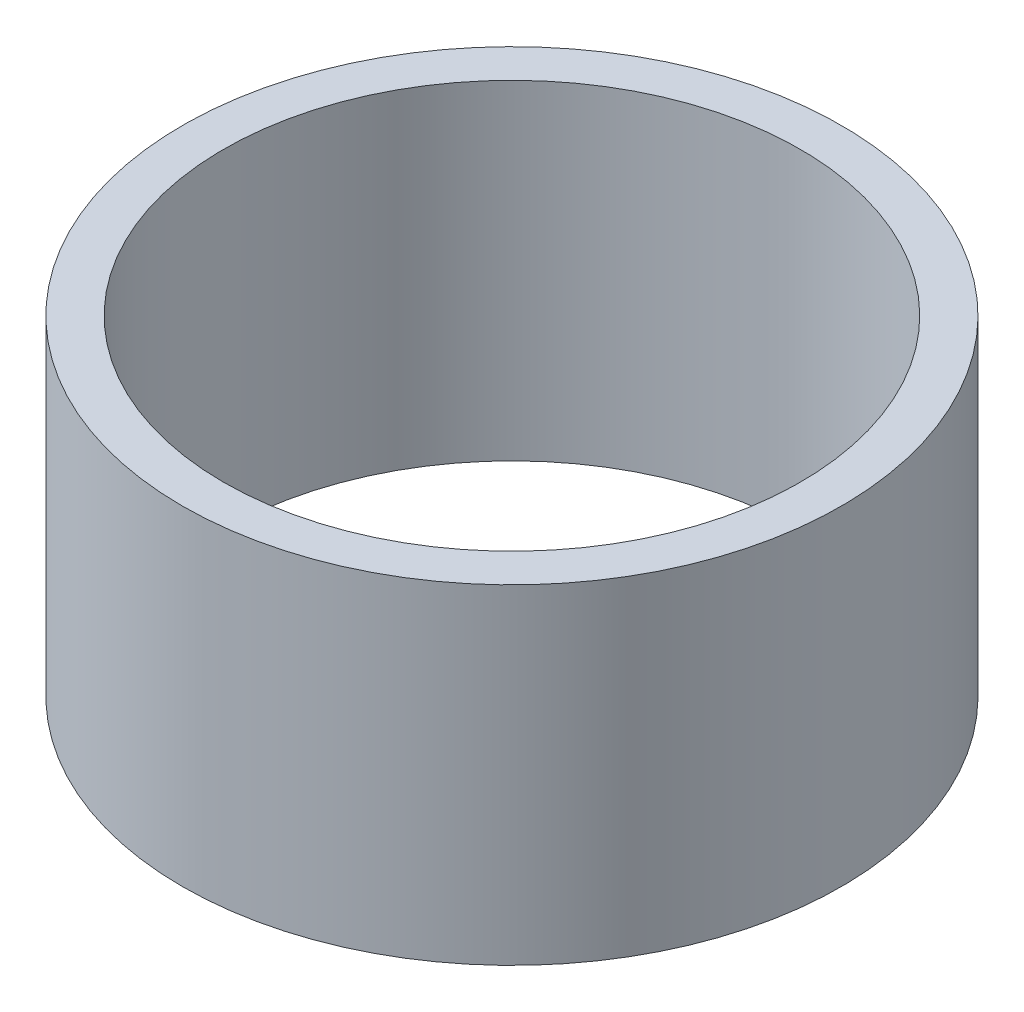
ISO-10303-21;
HEADER;
FILE_DESCRIPTION(('STEP AP214'),'2;1');
FILE_NAME('part.step','',(''),(''),'','','');
FILE_SCHEMA(('AUTOMOTIVE_DESIGN { 1 0 10303 214 1 1 1 1 }'));
ENDSEC;
DATA;
#1=APPLICATION_CONTEXT('core data for automotive mechanical design processes');
#2=APPLICATION_PROTOCOL_DEFINITION('international standard','automotive_design',2000,#1);
#3=PRODUCT_CONTEXT('',#1,'mechanical');
#4=PRODUCT('Part','Part','',(#3));
#5=PRODUCT_RELATED_PRODUCT_CATEGORY('part','',(#4));
#6=PRODUCT_DEFINITION_FORMATION('','',#4);
#7=PRODUCT_DEFINITION_CONTEXT('part definition',#1,'design');
#8=PRODUCT_DEFINITION('design','',#6,#7);
#9=PRODUCT_DEFINITION_SHAPE('','',#8);
#10=(LENGTH_UNIT() NAMED_UNIT(*) SI_UNIT(.MILLI.,.METRE.));
#11=(NAMED_UNIT(*) PLANE_ANGLE_UNIT() SI_UNIT($,.RADIAN.));
#12=(NAMED_UNIT(*) SI_UNIT($,.STERADIAN.) SOLID_ANGLE_UNIT());
#13=UNCERTAINTY_MEASURE_WITH_UNIT(LENGTH_MEASURE(1.E-05),#10,'distance_accuracy_value','');
#14=(GEOMETRIC_REPRESENTATION_CONTEXT(3) GLOBAL_UNCERTAINTY_ASSIGNED_CONTEXT((#13)) GLOBAL_UNIT_ASSIGNED_CONTEXT((#10,
#11,#12)) REPRESENTATION_CONTEXT('',''));
#15=CARTESIAN_POINT('',(0.,0.,0.));
#16=DIRECTION('',(0.,0.,1.));
#17=DIRECTION('',(1.,0.,0.));
#18=AXIS2_PLACEMENT_3D('',#15,#16,#17);
#19=CARTESIAN_POINT('',(0.,2.,0.));
#20=DIRECTION('',(0.,1.,0.));
#21=DIRECTION('',(0.,0.,1.));
#22=AXIS2_PLACEMENT_3D('',#19,#20,#21);
#23=PLANE('',#22);
#24=CARTESIAN_POINT('',(0.,2.,0.));
#25=DIRECTION('',(0.,1.,0.));
#26=DIRECTION('',(0.,0.,1.));
#27=AXIS2_PLACEMENT_3D('',#24,#25,#26);
#28=CIRCLE('',#27,2.);
#29=CARTESIAN_POINT('',(0.,2.,2.));
#30=VERTEX_POINT('',#29);
#31=EDGE_CURVE('E10',#30,#30,#28,.T.);
#32=ORIENTED_EDGE('',*,*,#31,.T.);
#33=EDGE_LOOP('',(#32));
#34=FACE_BOUND('',#33,.T.);
#35=CARTESIAN_POINT('',(0.,2.,0.));
#36=DIRECTION('',(0.,1.,0.));
#37=DIRECTION('',(0.,0.,1.));
#38=AXIS2_PLACEMENT_3D('',#35,#36,#37);
#39=CIRCLE('',#38,1.75);
#40=CARTESIAN_POINT('',(0.,2.,1.75));
#41=VERTEX_POINT('',#40);
#42=EDGE_CURVE('E50',#41,#41,#39,.T.);
#43=ORIENTED_EDGE('',*,*,#42,.F.);
#44=EDGE_LOOP('',(#43));
#45=FACE_BOUND('',#44,.T.);
#46=ADVANCED_FACE('F39',(#34,#45),#23,.T.);
#47=CARTESIAN_POINT('',(0.,0.,0.));
#48=DIRECTION('',(0.,1.,0.));
#49=DIRECTION('',(0.,0.,1.));
#50=AXIS2_PLACEMENT_3D('',#47,#48,#49);
#51=PLANE('',#50);
#52=CARTESIAN_POINT('',(0.,0.,0.));
#53=DIRECTION('',(0.,1.,0.));
#54=DIRECTION('',(0.,0.,1.));
#55=AXIS2_PLACEMENT_3D('',#52,#53,#54);
#56=CIRCLE('',#55,2.);
#57=CARTESIAN_POINT('',(0.,0.,2.));
#58=VERTEX_POINT('',#57);
#59=EDGE_CURVE('E43',#58,#58,#56,.T.);
#60=ORIENTED_EDGE('',*,*,#59,.F.);
#61=EDGE_LOOP('',(#60));
#62=FACE_BOUND('',#61,.T.);
#63=CARTESIAN_POINT('',(0.,0.,0.));
#64=DIRECTION('',(0.,1.,0.));
#65=DIRECTION('',(0.,0.,1.));
#66=AXIS2_PLACEMENT_3D('',#63,#64,#65);
#67=CIRCLE('',#66,1.75);
#68=CARTESIAN_POINT('',(0.,0.,1.75));
#69=VERTEX_POINT('',#68);
#70=EDGE_CURVE('E52',#69,#69,#67,.T.);
#71=ORIENTED_EDGE('',*,*,#70,.T.);
#72=EDGE_LOOP('',(#71));
#73=FACE_BOUND('',#72,.T.);
#74=ADVANCED_FACE('F62',(#62,#73),#51,.F.);
#75=CARTESIAN_POINT('',(0.,2.,0.));
#76=DIRECTION('',(0.,-1.,0.));
#77=DIRECTION('',(0.,0.,-1.));
#78=AXIS2_PLACEMENT_3D('',#75,#76,#77);
#79=CYLINDRICAL_SURFACE('',#78,2.);
#80=ORIENTED_EDGE('',*,*,#31,.F.);
#81=EDGE_LOOP('',(#80));
#82=FACE_BOUND('',#81,.T.);
#83=ORIENTED_EDGE('',*,*,#59,.T.);
#84=EDGE_LOOP('',(#83));
#85=FACE_BOUND('',#84,.T.);
#86=ADVANCED_FACE('F41',(#82,#85),#79,.T.);
#87=CARTESIAN_POINT('',(0.,2.,0.));
#88=DIRECTION('',(0.,-1.,0.));
#89=DIRECTION('',(0.,0.,-1.));
#90=AXIS2_PLACEMENT_3D('',#87,#88,#89);
#91=CYLINDRICAL_SURFACE('',#90,1.75);
#92=ORIENTED_EDGE('',*,*,#42,.T.);
#93=EDGE_LOOP('',(#92));
#94=FACE_BOUND('',#93,.T.);
#95=ORIENTED_EDGE('',*,*,#70,.F.);
#96=EDGE_LOOP('',(#95));
#97=FACE_BOUND('',#96,.T.);
#98=ADVANCED_FACE('F58',(#94,#97),#91,.F.);
#99=CLOSED_SHELL('',(#46,#74,#86,#98));
#100=MANIFOLD_SOLID_BREP('B2',#99);
#101=ADVANCED_BREP_SHAPE_REPRESENTATION('',(#18,#100),#14);
#102=SHAPE_DEFINITION_REPRESENTATION(#9,#101);
ENDSEC;
END-ISO-10303-21;
